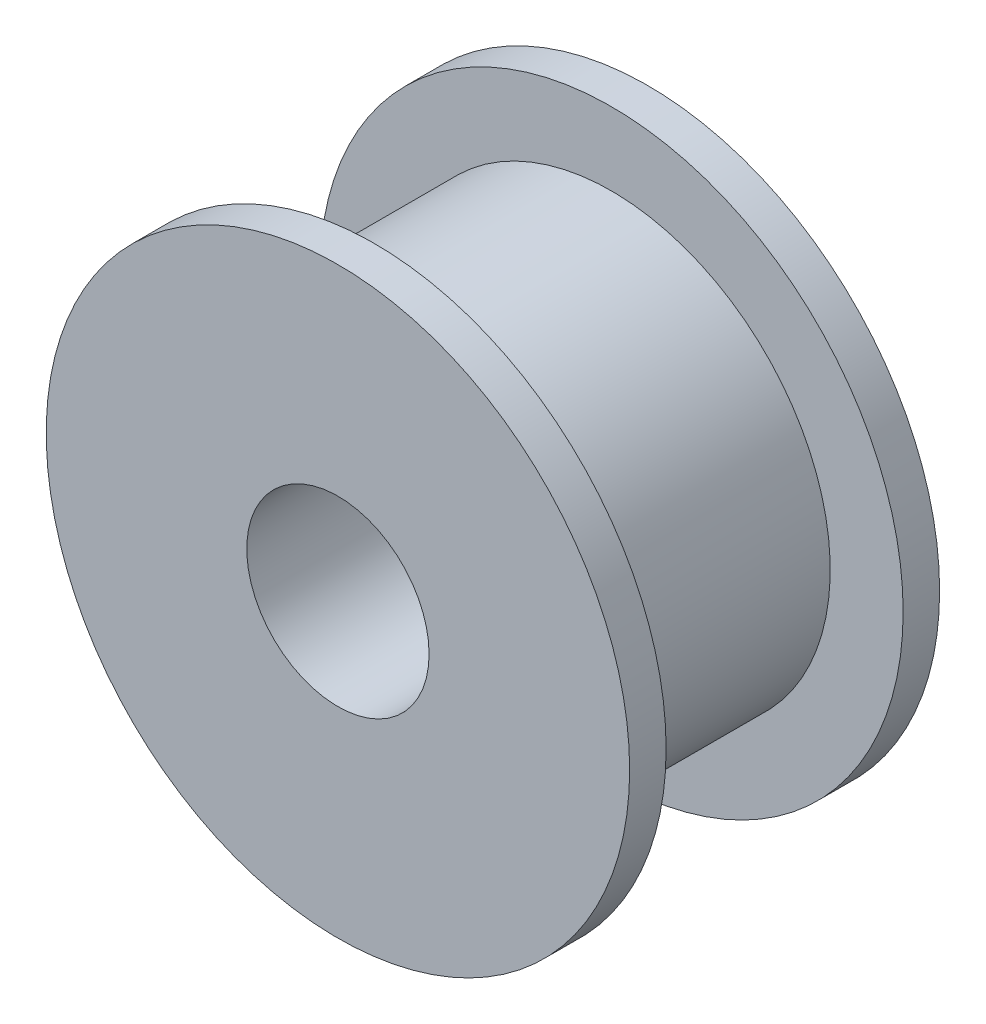
ISO-10303-21;
HEADER;
FILE_DESCRIPTION(('STEP AP214'),'2;1');
FILE_NAME('part.step','',(''),(''),'','','');
FILE_SCHEMA(('AUTOMOTIVE_DESIGN { 1 0 10303 214 1 1 1 1 }'));
ENDSEC;
DATA;
#1=APPLICATION_CONTEXT('core data for automotive mechanical design processes');
#2=APPLICATION_PROTOCOL_DEFINITION('international standard','automotive_design',2000,#1);
#3=PRODUCT_CONTEXT('',#1,'mechanical');
#4=PRODUCT('Part','Part','',(#3));
#5=PRODUCT_RELATED_PRODUCT_CATEGORY('part','',(#4));
#6=PRODUCT_DEFINITION_FORMATION('','',#4);
#7=PRODUCT_DEFINITION_CONTEXT('part definition',#1,'design');
#8=PRODUCT_DEFINITION('design','',#6,#7);
#9=PRODUCT_DEFINITION_SHAPE('','',#8);
#10=(LENGTH_UNIT() NAMED_UNIT(*) SI_UNIT(.MILLI.,.METRE.));
#11=(NAMED_UNIT(*) PLANE_ANGLE_UNIT() SI_UNIT($,.RADIAN.));
#12=(NAMED_UNIT(*) SI_UNIT($,.STERADIAN.) SOLID_ANGLE_UNIT());
#13=UNCERTAINTY_MEASURE_WITH_UNIT(LENGTH_MEASURE(1.E-05),#10,'distance_accuracy_value','');
#14=(GEOMETRIC_REPRESENTATION_CONTEXT(3) GLOBAL_UNCERTAINTY_ASSIGNED_CONTEXT((#13)) GLOBAL_UNIT_ASSIGNED_CONTEXT((#10,
#11,#12)) REPRESENTATION_CONTEXT('',''));
#15=CARTESIAN_POINT('',(0.,0.,0.));
#16=DIRECTION('',(0.,0.,1.));
#17=DIRECTION('',(1.,0.,0.));
#18=AXIS2_PLACEMENT_3D('',#15,#16,#17);
#19=CARTESIAN_POINT('',(0.,0.,7.5));
#20=DIRECTION('',(0.,0.,-1.));
#21=DIRECTION('',(-1.,0.,0.));
#22=AXIS2_PLACEMENT_3D('',#19,#20,#21);
#23=CYLINDRICAL_SURFACE('',#22,6.);
#24=CARTESIAN_POINT('',(0.,0.,1.));
#25=DIRECTION('',(0.,0.,1.));
#26=DIRECTION('',(1.,0.,0.));
#27=AXIS2_PLACEMENT_3D('',#24,#25,#26);
#28=CIRCLE('',#27,6.);
#29=CARTESIAN_POINT('',(-6.,0.,1.));
#30=VERTEX_POINT('',#29);
#31=EDGE_CURVE('E52',#30,#30,#28,.T.);
#32=CARTESIAN_POINT('',(0.,0.,7.5));
#33=DIRECTION('',(0.,0.,1.));
#34=DIRECTION('',(1.,0.,0.));
#35=AXIS2_PLACEMENT_3D('',#32,#33,#34);
#36=CIRCLE('',#35,6.);
#37=CARTESIAN_POINT('',(-6.,0.,7.5));
#38=VERTEX_POINT('',#37);
#39=EDGE_CURVE('E10',#38,#38,#36,.T.);
#40=CARTESIAN_POINT('',(-6.,0.,1.));
#41=CARTESIAN_POINT('',(-6.,0.,1.06770833333333));
#42=CARTESIAN_POINT('',(-6.,0.,1.13541666666667));
#43=CARTESIAN_POINT('',(-6.,0.,1.27083333333333));
#44=CARTESIAN_POINT('',(-6.,0.,1.33854166666667));
#45=CARTESIAN_POINT('',(-6.,0.,1.47395833333333));
#46=CARTESIAN_POINT('',(-6.,0.,1.54166666666667));
#47=CARTESIAN_POINT('',(-6.,0.,1.67708333333333));
#48=CARTESIAN_POINT('',(-6.,0.,1.74479166666667));
#49=CARTESIAN_POINT('',(-6.,0.,1.88020833333333));
#50=CARTESIAN_POINT('',(-6.,0.,1.94791666666667));
#51=CARTESIAN_POINT('',(-6.,0.,2.08333333333333));
#52=CARTESIAN_POINT('',(-6.,0.,2.15104166666667));
#53=CARTESIAN_POINT('',(-6.,0.,2.28645833333333));
#54=CARTESIAN_POINT('',(-6.,0.,2.35416666666667));
#55=CARTESIAN_POINT('',(-6.,0.,2.48958333333333));
#56=CARTESIAN_POINT('',(-6.,0.,2.55729166666667));
#57=CARTESIAN_POINT('',(-6.,0.,2.69270833333333));
#58=CARTESIAN_POINT('',(-6.,0.,2.76041666666667));
#59=CARTESIAN_POINT('',(-6.,0.,2.89583333333333));
#60=CARTESIAN_POINT('',(-6.,0.,2.96354166666667));
#61=CARTESIAN_POINT('',(-6.,0.,3.09895833333333));
#62=CARTESIAN_POINT('',(-6.,0.,3.16666666666667));
#63=CARTESIAN_POINT('',(-6.,0.,3.30208333333333));
#64=CARTESIAN_POINT('',(-6.,0.,3.36979166666667));
#65=CARTESIAN_POINT('',(-6.,0.,3.50520833333333));
#66=CARTESIAN_POINT('',(-6.,0.,3.57291666666667));
#67=CARTESIAN_POINT('',(-6.,0.,3.70833333333333));
#68=CARTESIAN_POINT('',(-6.,0.,3.77604166666667));
#69=CARTESIAN_POINT('',(-6.,0.,3.91145833333333));
#70=CARTESIAN_POINT('',(-6.,0.,3.97916666666667));
#71=CARTESIAN_POINT('',(-6.,0.,4.11458333333333));
#72=CARTESIAN_POINT('',(-6.,0.,4.18229166666667));
#73=CARTESIAN_POINT('',(-6.,0.,4.31770833333333));
#74=CARTESIAN_POINT('',(-6.,0.,4.38541666666667));
#75=CARTESIAN_POINT('',(-6.,0.,4.52083333333333));
#76=CARTESIAN_POINT('',(-6.,0.,4.58854166666667));
#77=CARTESIAN_POINT('',(-6.,0.,4.72395833333333));
#78=CARTESIAN_POINT('',(-6.,0.,4.79166666666667));
#79=CARTESIAN_POINT('',(-6.,0.,4.92708333333333));
#80=CARTESIAN_POINT('',(-6.,0.,4.99479166666667));
#81=CARTESIAN_POINT('',(-6.,0.,5.13020833333333));
#82=CARTESIAN_POINT('',(-6.,0.,5.19791666666667));
#83=CARTESIAN_POINT('',(-6.,0.,5.33333333333333));
#84=CARTESIAN_POINT('',(-6.,0.,5.40104166666667));
#85=CARTESIAN_POINT('',(-6.,0.,5.53645833333333));
#86=CARTESIAN_POINT('',(-6.,0.,5.60416666666667));
#87=CARTESIAN_POINT('',(-6.,0.,5.73958333333333));
#88=CARTESIAN_POINT('',(-6.,0.,5.80729166666667));
#89=CARTESIAN_POINT('',(-6.,0.,5.94270833333333));
#90=CARTESIAN_POINT('',(-6.,0.,6.01041666666667));
#91=CARTESIAN_POINT('',(-6.,0.,6.14583333333333));
#92=CARTESIAN_POINT('',(-6.,0.,6.21354166666667));
#93=CARTESIAN_POINT('',(-6.,0.,6.34895833333333));
#94=CARTESIAN_POINT('',(-6.,0.,6.41666666666667));
#95=CARTESIAN_POINT('',(-6.,0.,6.55208333333333));
#96=CARTESIAN_POINT('',(-6.,0.,6.61979166666667));
#97=CARTESIAN_POINT('',(-6.,0.,6.75520833333333));
#98=CARTESIAN_POINT('',(-6.,0.,6.82291666666667));
#99=CARTESIAN_POINT('',(-6.,0.,6.95833333333333));
#100=CARTESIAN_POINT('',(-6.,0.,7.02604166666667));
#101=CARTESIAN_POINT('',(-6.,0.,7.16145833333333));
#102=CARTESIAN_POINT('',(-6.,0.,7.22916666666667));
#103=CARTESIAN_POINT('',(-6.,0.,7.36458333333333));
#104=CARTESIAN_POINT('',(-6.,0.,7.43229166666667));
#105=CARTESIAN_POINT('',(-6.,0.,7.5));
#106=B_SPLINE_CURVE_WITH_KNOTS('',3,(#40,#41,#42,#43,#44,#45,#46,#47,#48,#49,#50,#51,#52,#53,
#54,#55,#56,#57,#58,#59,#60,#61,#62,#63,#64,#65,#66,#67,#68,#69,#70,#71,#72,#73,#74,#75,#76,#77,
#78,#79,#80,#81,#82,#83,#84,#85,#86,#87,#88,#89,#90,#91,#92,#93,#94,#95,#96,#97,#98,#99,#100,
#101,#102,#103,#104,#105),.UNSPECIFIED.,.F.,.F.,(4,2,2,2,2,2,2,2,2,2,2,2,2,2,2,2,2,2,2,2,2,2,2,
2,2,2,2,2,2,2,2,2,4),(0.,0.203125,0.40625,0.609375000000001,0.8125,1.015625,1.21875,1.421875,
1.625,1.828125,2.03125,2.234375,2.4375,2.640625,2.84375,3.046875,3.25,3.453125,3.65625,3.859375,
4.0625,4.265625,4.46875,4.671875,4.875,5.078125,5.28125,5.484375,5.6875,5.890625,6.09375,
6.296875,6.5),.UNSPECIFIED.);
#107=EDGE_CURVE('BSEAM32',#30,#38,#106,.T.);
#108=ORIENTED_EDGE('',*,*,#31,.T.);
#109=ORIENTED_EDGE('',*,*,#39,.F.);
#110=ORIENTED_EDGE('',*,*,#107,.T.);
#111=ORIENTED_EDGE('',*,*,#107,.F.);
#112=EDGE_LOOP('',(#108,#110,#109,#111));
#113=FACE_BOUND('',#112,.T.);
#114=ADVANCED_FACE('F32',(#113),#23,.T.);
#115=CARTESIAN_POINT('',(0.,0.,1.));
#116=DIRECTION('',(0.,0.,1.));
#117=DIRECTION('',(1.,0.,0.));
#118=AXIS2_PLACEMENT_3D('',#115,#116,#117);
#119=PLANE('',#118);
#120=CARTESIAN_POINT('',(0.,0.,1.));
#121=DIRECTION('',(0.,0.,1.));
#122=DIRECTION('',(1.,0.,0.));
#123=AXIS2_PLACEMENT_3D('',#120,#121,#122);
#124=CIRCLE('',#123,8.);
#125=CARTESIAN_POINT('',(8.,0.,1.));
#126=VERTEX_POINT('',#125);
#127=EDGE_CURVE('E39',#126,#126,#124,.T.);
#128=ORIENTED_EDGE('',*,*,#127,.T.);
#129=EDGE_LOOP('',(#128));
#130=FACE_BOUND('',#129,.T.);
#131=ORIENTED_EDGE('',*,*,#31,.F.);
#132=EDGE_LOOP('',(#131));
#133=FACE_BOUND('',#132,.T.);
#134=ADVANCED_FACE('F83',(#130,#133),#119,.T.);
#135=CARTESIAN_POINT('',(0.,0.,0.));
#136=DIRECTION('',(0.,0.,1.));
#137=DIRECTION('',(1.,0.,0.));
#138=AXIS2_PLACEMENT_3D('',#135,#136,#137);
#139=PLANE('',#138);
#140=CARTESIAN_POINT('',(0.,0.,0.));
#141=DIRECTION('',(0.,0.,1.));
#142=DIRECTION('',(1.,0.,0.));
#143=AXIS2_PLACEMENT_3D('',#140,#141,#142);
#144=CIRCLE('',#143,8.);
#145=CARTESIAN_POINT('',(8.,0.,0.));
#146=VERTEX_POINT('',#145);
#147=EDGE_CURVE('E43',#146,#146,#144,.T.);
#148=ORIENTED_EDGE('',*,*,#147,.F.);
#149=EDGE_LOOP('',(#148));
#150=FACE_BOUND('',#149,.T.);
#151=CARTESIAN_POINT('',(0.,0.,0.));
#152=DIRECTION('',(0.,0.,1.));
#153=DIRECTION('',(1.,0.,0.));
#154=AXIS2_PLACEMENT_3D('',#151,#152,#153);
#155=CIRCLE('',#154,2.5);
#156=CARTESIAN_POINT('',(2.5,0.,0.));
#157=VERTEX_POINT('',#156);
#158=EDGE_CURVE('E48',#157,#157,#155,.T.);
#159=ORIENTED_EDGE('',*,*,#158,.T.);
#160=EDGE_LOOP('',(#159));
#161=FACE_BOUND('',#160,.T.);
#162=ADVANCED_FACE('F89',(#150,#161),#139,.F.);
#163=CARTESIAN_POINT('',(0.,0.,1.));
#164=DIRECTION('',(0.,0.,-1.));
#165=DIRECTION('',(-1.,0.,0.));
#166=AXIS2_PLACEMENT_3D('',#163,#164,#165);
#167=CYLINDRICAL_SURFACE('',#166,8.);
#168=ORIENTED_EDGE('',*,*,#127,.F.);
#169=EDGE_LOOP('',(#168));
#170=FACE_BOUND('',#169,.T.);
#171=ORIENTED_EDGE('',*,*,#147,.T.);
#172=EDGE_LOOP('',(#171));
#173=FACE_BOUND('',#172,.T.);
#174=ADVANCED_FACE('F34',(#170,#173),#167,.T.);
#175=CARTESIAN_POINT('',(0.,0.,1.));
#176=DIRECTION('',(0.,0.,-1.));
#177=DIRECTION('',(-1.,0.,0.));
#178=AXIS2_PLACEMENT_3D('',#175,#176,#177);
#179=CYLINDRICAL_SURFACE('',#178,2.5);
#180=ORIENTED_EDGE('',*,*,#158,.F.);
#181=EDGE_LOOP('',(#180));
#182=FACE_BOUND('',#181,.T.);
#183=CARTESIAN_POINT('',(0.,0.,8.5));
#184=DIRECTION('',(0.,0.,1.));
#185=DIRECTION('',(1.,0.,0.));
#186=AXIS2_PLACEMENT_3D('',#183,#184,#185);
#187=CIRCLE('',#186,2.5);
#188=CARTESIAN_POINT('',(2.5,0.,8.5));
#189=VERTEX_POINT('',#188);
#190=EDGE_CURVE('E55',#189,#189,#187,.T.);
#191=ORIENTED_EDGE('',*,*,#190,.T.);
#192=EDGE_LOOP('',(#191));
#193=FACE_BOUND('',#192,.T.);
#194=ADVANCED_FACE('F79',(#182,#193),#179,.F.);
#195=CARTESIAN_POINT('',(0.,0.,8.5));
#196=DIRECTION('',(0.,0.,1.));
#197=DIRECTION('',(1.,0.,0.));
#198=AXIS2_PLACEMENT_3D('',#195,#196,#197);
#199=PLANE('',#198);
#200=ORIENTED_EDGE('',*,*,#190,.F.);
#201=EDGE_LOOP('',(#200));
#202=FACE_BOUND('',#201,.T.);
#203=CARTESIAN_POINT('',(0.,0.,8.5));
#204=DIRECTION('',(0.,0.,1.));
#205=DIRECTION('',(1.,0.,0.));
#206=AXIS2_PLACEMENT_3D('',#203,#204,#205);
#207=CIRCLE('',#206,8.);
#208=CARTESIAN_POINT('',(8.,0.,8.5));
#209=VERTEX_POINT('',#208);
#210=EDGE_CURVE('E58',#209,#209,#207,.T.);
#211=ORIENTED_EDGE('',*,*,#210,.T.);
#212=EDGE_LOOP('',(#211));
#213=FACE_BOUND('',#212,.T.);
#214=ADVANCED_FACE('F65',(#202,#213),#199,.T.);
#215=CARTESIAN_POINT('',(0.,0.,7.5));
#216=DIRECTION('',(0.,0.,1.));
#217=DIRECTION('',(1.,0.,0.));
#218=AXIS2_PLACEMENT_3D('',#215,#216,#217);
#219=PLANE('',#218);
#220=CARTESIAN_POINT('',(0.,0.,7.5));
#221=DIRECTION('',(0.,0.,1.));
#222=DIRECTION('',(1.,0.,0.));
#223=AXIS2_PLACEMENT_3D('',#220,#221,#222);
#224=CIRCLE('',#223,8.);
#225=CARTESIAN_POINT('',(8.,0.,7.5));
#226=VERTEX_POINT('',#225);
#227=EDGE_CURVE('E59',#226,#226,#224,.T.);
#228=ORIENTED_EDGE('',*,*,#227,.F.);
#229=EDGE_LOOP('',(#228));
#230=FACE_BOUND('',#229,.T.);
#231=ORIENTED_EDGE('',*,*,#39,.T.);
#232=EDGE_LOOP('',(#231));
#233=FACE_BOUND('',#232,.T.);
#234=ADVANCED_FACE('F70',(#230,#233),#219,.F.);
#235=CARTESIAN_POINT('',(0.,0.,8.5));
#236=DIRECTION('',(0.,0.,-1.));
#237=DIRECTION('',(-1.,0.,0.));
#238=AXIS2_PLACEMENT_3D('',#235,#236,#237);
#239=CYLINDRICAL_SURFACE('',#238,8.);
#240=ORIENTED_EDGE('',*,*,#210,.F.);
#241=EDGE_LOOP('',(#240));
#242=FACE_BOUND('',#241,.T.);
#243=ORIENTED_EDGE('',*,*,#227,.T.);
#244=EDGE_LOOP('',(#243));
#245=FACE_BOUND('',#244,.T.);
#246=ADVANCED_FACE('F67',(#242,#245),#239,.T.);
#247=CLOSED_SHELL('',(#114,#134,#162,#174,#194,#214,#234,#246));
#248=MANIFOLD_SOLID_BREP('B2',#247);
#249=ADVANCED_BREP_SHAPE_REPRESENTATION('',(#18,#248),#14);
#250=SHAPE_DEFINITION_REPRESENTATION(#9,#249);
ENDSEC;
END-ISO-10303-21;
